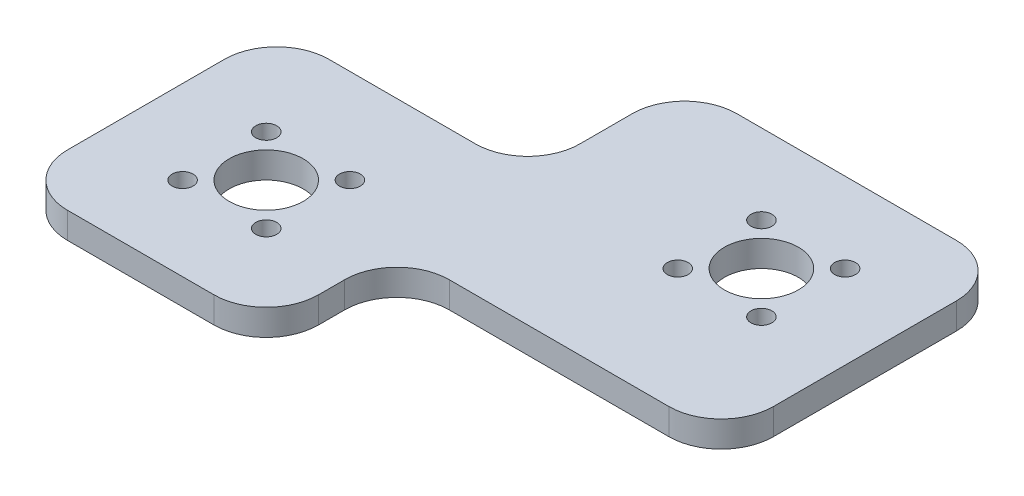
ISO-10303-21;
HEADER;
FILE_DESCRIPTION(('STEP AP214'),'2;1');
FILE_NAME('part.step','',(''),(''),'','','');
FILE_SCHEMA(('AUTOMOTIVE_DESIGN { 1 0 10303 214 1 1 1 1 }'));
ENDSEC;
DATA;
#1=APPLICATION_CONTEXT('core data for automotive mechanical design processes');
#2=APPLICATION_PROTOCOL_DEFINITION('international standard','automotive_design',2000,#1);
#3=PRODUCT_CONTEXT('',#1,'mechanical');
#4=PRODUCT('Part','Part','',(#3));
#5=PRODUCT_RELATED_PRODUCT_CATEGORY('part','',(#4));
#6=PRODUCT_DEFINITION_FORMATION('','',#4);
#7=PRODUCT_DEFINITION_CONTEXT('part definition',#1,'design');
#8=PRODUCT_DEFINITION('design','',#6,#7);
#9=PRODUCT_DEFINITION_SHAPE('','',#8);
#10=(LENGTH_UNIT() NAMED_UNIT(*) SI_UNIT(.MILLI.,.METRE.));
#11=(NAMED_UNIT(*) PLANE_ANGLE_UNIT() SI_UNIT($,.RADIAN.));
#12=(NAMED_UNIT(*) SI_UNIT($,.STERADIAN.) SOLID_ANGLE_UNIT());
#13=UNCERTAINTY_MEASURE_WITH_UNIT(LENGTH_MEASURE(1.E-05),#10,'distance_accuracy_value','');
#14=(GEOMETRIC_REPRESENTATION_CONTEXT(3) GLOBAL_UNCERTAINTY_ASSIGNED_CONTEXT((#13)) GLOBAL_UNIT_ASSIGNED_CONTEXT((#10,
#11,#12)) REPRESENTATION_CONTEXT('',''));
#15=CARTESIAN_POINT('',(0.,0.,0.));
#16=DIRECTION('',(0.,0.,1.));
#17=DIRECTION('',(1.,0.,0.));
#18=AXIS2_PLACEMENT_3D('',#15,#16,#17);
#19=CARTESIAN_POINT('',(0.,5.,-46.9463087248322));
#20=DIRECTION('',(0.,0.,-1.));
#21=DIRECTION('',(-1.,0.,0.));
#22=AXIS2_PLACEMENT_3D('',#19,#20,#21);
#23=PLANE('',#22);
#24=DIRECTION('',(1.,0.,0.));
#25=VECTOR('',#24,1.);
#26=CARTESIAN_POINT('',(0.,5.,-46.9463087248322));
#27=LINE('',#26,#25);
#28=CARTESIAN_POINT('',(-30.9261744966443,5.,-46.9463087248322));
#29=VERTEX_POINT('',#28);
#30=CARTESIAN_POINT('',(11.0738255033557,5.,-46.9463087248322));
#31=VERTEX_POINT('',#30);
#32=EDGE_CURVE('E242',#29,#31,#27,.T.);
#33=ORIENTED_EDGE('',*,*,#32,.T.);
#34=DIRECTION('',(0.,-1.,0.));
#35=VECTOR('',#34,1.);
#36=CARTESIAN_POINT('',(11.0738255033557,0.,-46.9463087248322));
#37=LINE('',#36,#35);
#38=CARTESIAN_POINT('',(11.0738255033557,0.,-46.9463087248322));
#39=VERTEX_POINT('',#38);
#40=EDGE_CURVE('E289',#31,#39,#37,.T.);
#41=ORIENTED_EDGE('',*,*,#40,.T.);
#42=DIRECTION('',(1.,0.,0.));
#43=VECTOR('',#42,1.);
#44=CARTESIAN_POINT('',(0.,0.,-46.9463087248322));
#45=LINE('',#44,#43);
#46=CARTESIAN_POINT('',(-30.9261744966443,0.,-46.9463087248322));
#47=VERTEX_POINT('',#46);
#48=EDGE_CURVE('E307',#47,#39,#45,.T.);
#49=ORIENTED_EDGE('',*,*,#48,.F.);
#50=DIRECTION('',(0.,-1.,0.));
#51=VECTOR('',#50,1.);
#52=CARTESIAN_POINT('',(-30.9261744966443,5.,-46.9463087248322));
#53=LINE('',#52,#51);
#54=EDGE_CURVE('E287',#47,#29,#53,.F.);
#55=ORIENTED_EDGE('',*,*,#54,.T.);
#56=EDGE_LOOP('',(#33,#41,#49,#55));
#57=FACE_BOUND('',#56,.T.);
#58=ADVANCED_FACE('F88',(#57),#23,.T.);
#59=CARTESIAN_POINT('',(-40.9261744966443,5.,0.));
#60=DIRECTION('',(-1.,0.,0.));
#61=DIRECTION('',(0.,0.,1.));
#62=AXIS2_PLACEMENT_3D('',#59,#60,#61);
#63=PLANE('',#62);
#64=DIRECTION('',(0.,0.,-1.));
#65=VECTOR('',#64,1.);
#66=CARTESIAN_POINT('',(-40.9261744966443,5.,0.));
#67=LINE('',#66,#65);
#68=CARTESIAN_POINT('',(-40.9261744966443,5.,-26.9463087248322));
#69=VERTEX_POINT('',#68);
#70=CARTESIAN_POINT('',(-40.9261744966443,5.,-36.9463087248322));
#71=VERTEX_POINT('',#70);
#72=EDGE_CURVE('E313',#69,#71,#67,.T.);
#73=ORIENTED_EDGE('',*,*,#72,.T.);
#74=DIRECTION('',(0.,-1.,0.));
#75=VECTOR('',#74,1.);
#76=CARTESIAN_POINT('',(-40.9261744966443,5.,-36.9463087248322));
#77=LINE('',#76,#75);
#78=CARTESIAN_POINT('',(-40.9261744966443,0.,-36.9463087248322));
#79=VERTEX_POINT('',#78);
#80=EDGE_CURVE('E293',#71,#79,#77,.T.);
#81=ORIENTED_EDGE('',*,*,#80,.T.);
#82=DIRECTION('',(0.,0.,-1.));
#83=VECTOR('',#82,1.);
#84=CARTESIAN_POINT('',(-40.9261744966443,0.,0.));
#85=LINE('',#84,#83);
#86=CARTESIAN_POINT('',(-40.9261744966443,0.,-26.9463087248322));
#87=VERTEX_POINT('',#86);
#88=EDGE_CURVE('E231',#87,#79,#85,.T.);
#89=ORIENTED_EDGE('',*,*,#88,.F.);
#90=DIRECTION('',(0.,-1.,0.));
#91=VECTOR('',#90,1.);
#92=CARTESIAN_POINT('',(-40.9261744966443,5.,-26.9463087248322));
#93=LINE('',#92,#91);
#94=EDGE_CURVE('E110',#87,#69,#93,.F.);
#95=ORIENTED_EDGE('',*,*,#94,.T.);
#96=EDGE_LOOP('',(#73,#81,#89,#95));
#97=FACE_BOUND('',#96,.T.);
#98=ADVANCED_FACE('F305',(#97),#63,.T.);
#99=CARTESIAN_POINT('',(0.,5.,-16.9463087248322));
#100=DIRECTION('',(0.,0.,-1.));
#101=DIRECTION('',(-1.,0.,0.));
#102=AXIS2_PLACEMENT_3D('',#99,#100,#101);
#103=PLANE('',#102);
#104=DIRECTION('',(1.,0.,0.));
#105=VECTOR('',#104,1.);
#106=CARTESIAN_POINT('',(0.,5.,-16.9463087248322));
#107=LINE('',#106,#105);
#108=CARTESIAN_POINT('',(-78.9261744966443,5.,-16.9463087248322));
#109=VERTEX_POINT('',#108);
#110=CARTESIAN_POINT('',(-50.9261744966443,5.,-16.9463087248322));
#111=VERTEX_POINT('',#110);
#112=EDGE_CURVE('E312',#109,#111,#107,.T.);
#113=ORIENTED_EDGE('',*,*,#112,.T.);
#114=DIRECTION('',(0.,-1.,0.));
#115=VECTOR('',#114,1.);
#116=CARTESIAN_POINT('',(-50.9261744966443,0.,-16.9463087248322));
#117=LINE('',#116,#115);
#118=CARTESIAN_POINT('',(-50.9261744966443,0.,-16.9463087248322));
#119=VERTEX_POINT('',#118);
#120=EDGE_CURVE('E296',#111,#119,#117,.T.);
#121=ORIENTED_EDGE('',*,*,#120,.T.);
#122=DIRECTION('',(1.,0.,0.));
#123=VECTOR('',#122,1.);
#124=CARTESIAN_POINT('',(0.,0.,-16.9463087248322));
#125=LINE('',#124,#123);
#126=CARTESIAN_POINT('',(-78.9261744966443,0.,-16.9463087248322));
#127=VERTEX_POINT('',#126);
#128=EDGE_CURVE('E227',#127,#119,#125,.T.);
#129=ORIENTED_EDGE('',*,*,#128,.F.);
#130=DIRECTION('',(0.,-1.,0.));
#131=VECTOR('',#130,1.);
#132=CARTESIAN_POINT('',(-78.9261744966443,5.,-16.9463087248322));
#133=LINE('',#132,#131);
#134=EDGE_CURVE('E207',#127,#109,#133,.F.);
#135=ORIENTED_EDGE('',*,*,#134,.T.);
#136=EDGE_LOOP('',(#113,#121,#129,#135));
#137=FACE_BOUND('',#136,.T.);
#138=ADVANCED_FACE('F315',(#137),#103,.T.);
#139=CARTESIAN_POINT('',(-88.9261744966443,5.,0.));
#140=DIRECTION('',(1.,0.,0.));
#141=DIRECTION('',(0.,0.,-1.));
#142=AXIS2_PLACEMENT_3D('',#139,#140,#141);
#143=PLANE('',#142);
#144=DIRECTION('',(0.,0.,1.));
#145=VECTOR('',#144,1.);
#146=CARTESIAN_POINT('',(-88.9261744966443,0.,0.));
#147=LINE('',#146,#145);
#148=CARTESIAN_POINT('',(-88.9261744966443,0.,-6.94630872483223));
#149=VERTEX_POINT('',#148);
#150=CARTESIAN_POINT('',(-88.9261744966443,0.,23.0536912751678));
#151=VERTEX_POINT('',#150);
#152=EDGE_CURVE('E217',#149,#151,#147,.T.);
#153=ORIENTED_EDGE('',*,*,#152,.T.);
#154=DIRECTION('',(0.,-1.,0.));
#155=VECTOR('',#154,1.);
#156=CARTESIAN_POINT('',(-88.9261744966443,5.,23.0536912751678));
#157=LINE('',#156,#155);
#158=CARTESIAN_POINT('',(-88.9261744966443,5.,23.0536912751678));
#159=VERTEX_POINT('',#158);
#160=EDGE_CURVE('E261',#151,#159,#157,.F.);
#161=ORIENTED_EDGE('',*,*,#160,.T.);
#162=DIRECTION('',(0.,0.,1.));
#163=VECTOR('',#162,1.);
#164=CARTESIAN_POINT('',(-88.9261744966443,5.,0.));
#165=LINE('',#164,#163);
#166=CARTESIAN_POINT('',(-88.9261744966443,5.,-6.94630872483223));
#167=VERTEX_POINT('',#166);
#168=EDGE_CURVE('E220',#167,#159,#165,.T.);
#169=ORIENTED_EDGE('',*,*,#168,.F.);
#170=DIRECTION('',(0.,-1.,0.));
#171=VECTOR('',#170,1.);
#172=CARTESIAN_POINT('',(-88.9261744966443,0.,-6.94630872483223));
#173=LINE('',#172,#171);
#174=EDGE_CURVE('E206',#167,#149,#173,.T.);
#175=ORIENTED_EDGE('',*,*,#174,.T.);
#176=EDGE_LOOP('',(#153,#161,#169,#175));
#177=FACE_BOUND('',#176,.T.);
#178=ADVANCED_FACE('F216',(#177),#143,.F.);
#179=CARTESIAN_POINT('',(0.,5.,33.0536912751678));
#180=DIRECTION('',(0.,0.,1.));
#181=DIRECTION('',(1.,0.,0.));
#182=AXIS2_PLACEMENT_3D('',#179,#180,#181);
#183=PLANE('',#182);
#184=DIRECTION('',(-1.,0.,0.));
#185=VECTOR('',#184,1.);
#186=CARTESIAN_POINT('',(0.,5.,33.0536912751678));
#187=LINE('',#186,#185);
#188=CARTESIAN_POINT('',(-50.9261744966443,5.,33.0536912751678));
#189=VERTEX_POINT('',#188);
#190=CARTESIAN_POINT('',(-78.9261744966443,5.,33.0536912751678));
#191=VERTEX_POINT('',#190);
#192=EDGE_CURVE('E317',#189,#191,#187,.T.);
#193=ORIENTED_EDGE('',*,*,#192,.T.);
#194=DIRECTION('',(0.,-1.,0.));
#195=VECTOR('',#194,1.);
#196=CARTESIAN_POINT('',(-78.9261744966443,0.,33.0536912751678));
#197=LINE('',#196,#195);
#198=CARTESIAN_POINT('',(-78.9261744966443,0.,33.0536912751678));
#199=VERTEX_POINT('',#198);
#200=EDGE_CURVE('E249',#191,#199,#197,.T.);
#201=ORIENTED_EDGE('',*,*,#200,.T.);
#202=DIRECTION('',(-1.,0.,0.));
#203=VECTOR('',#202,1.);
#204=CARTESIAN_POINT('',(0.,0.,33.0536912751678));
#205=LINE('',#204,#203);
#206=CARTESIAN_POINT('',(-50.9261744966443,0.,33.0536912751678));
#207=VERTEX_POINT('',#206);
#208=EDGE_CURVE('E226',#207,#199,#205,.T.);
#209=ORIENTED_EDGE('',*,*,#208,.F.);
#210=DIRECTION('',(0.,-1.,0.));
#211=VECTOR('',#210,1.);
#212=CARTESIAN_POINT('',(-50.9261744966443,5.,33.0536912751678));
#213=LINE('',#212,#211);
#214=EDGE_CURVE('E247',#207,#189,#213,.F.);
#215=ORIENTED_EDGE('',*,*,#214,.T.);
#216=EDGE_LOOP('',(#193,#201,#209,#215));
#217=FACE_BOUND('',#216,.T.);
#218=ADVANCED_FACE('F383',(#217),#183,.T.);
#219=CARTESIAN_POINT('',(-40.9261744966443,5.,0.));
#220=DIRECTION('',(-1.,0.,0.));
#221=DIRECTION('',(0.,0.,1.));
#222=AXIS2_PLACEMENT_3D('',#219,#220,#221);
#223=PLANE('',#222);
#224=DIRECTION('',(0.,0.,-1.));
#225=VECTOR('',#224,1.);
#226=CARTESIAN_POINT('',(-40.9261744966443,5.,0.));
#227=LINE('',#226,#225);
#228=CARTESIAN_POINT('',(-40.9261744966443,5.,23.0536912751678));
#229=VERTEX_POINT('',#228);
#230=CARTESIAN_POINT('',(-40.9261744966443,5.,18.0536912751678));
#231=VERTEX_POINT('',#230);
#232=EDGE_CURVE('E324',#229,#231,#227,.T.);
#233=ORIENTED_EDGE('',*,*,#232,.F.);
#234=DIRECTION('',(0.,-1.,0.));
#235=VECTOR('',#234,1.);
#236=CARTESIAN_POINT('',(-40.9261744966443,0.,23.0536912751678));
#237=LINE('',#236,#235);
#238=CARTESIAN_POINT('',(-40.9261744966443,0.,23.0536912751678));
#239=VERTEX_POINT('',#238);
#240=EDGE_CURVE('E274',#229,#239,#237,.T.);
#241=ORIENTED_EDGE('',*,*,#240,.T.);
#242=DIRECTION('',(0.,0.,-1.));
#243=VECTOR('',#242,1.);
#244=CARTESIAN_POINT('',(-40.9261744966443,0.,0.));
#245=LINE('',#244,#243);
#246=CARTESIAN_POINT('',(-40.9261744966443,0.,18.0536912751678));
#247=VERTEX_POINT('',#246);
#248=EDGE_CURVE('E229',#239,#247,#245,.T.);
#249=ORIENTED_EDGE('',*,*,#248,.T.);
#250=DIRECTION('',(0.,-1.,0.));
#251=VECTOR('',#250,1.);
#252=CARTESIAN_POINT('',(-40.9261744966443,5.,18.0536912751678));
#253=LINE('',#252,#251);
#254=EDGE_CURVE('E272',#247,#231,#253,.F.);
#255=ORIENTED_EDGE('',*,*,#254,.T.);
#256=EDGE_LOOP('',(#233,#241,#249,#255));
#257=FACE_BOUND('',#256,.T.);
#258=ADVANCED_FACE('F375',(#257),#223,.F.);
#259=CARTESIAN_POINT('',(0.,5.,8.05369127516778));
#260=DIRECTION('',(0.,0.,1.));
#261=DIRECTION('',(1.,0.,0.));
#262=AXIS2_PLACEMENT_3D('',#259,#260,#261);
#263=PLANE('',#262);
#264=DIRECTION('',(-1.,0.,0.));
#265=VECTOR('',#264,1.);
#266=CARTESIAN_POINT('',(0.,5.,8.05369127516778));
#267=LINE('',#266,#265);
#268=CARTESIAN_POINT('',(11.0738255033557,5.,8.05369127516779));
#269=VERTEX_POINT('',#268);
#270=CARTESIAN_POINT('',(-30.9261744966443,5.,8.05369127516777));
#271=VERTEX_POINT('',#270);
#272=EDGE_CURVE('E327',#269,#271,#267,.T.);
#273=ORIENTED_EDGE('',*,*,#272,.T.);
#274=DIRECTION('',(0.,-1.,0.));
#275=VECTOR('',#274,1.);
#276=CARTESIAN_POINT('',(-30.9261744966443,5.,8.05369127516777));
#277=LINE('',#276,#275);
#278=CARTESIAN_POINT('',(-30.9261744966443,0.,8.05369127516777));
#279=VERTEX_POINT('',#278);
#280=EDGE_CURVE('E279',#271,#279,#277,.T.);
#281=ORIENTED_EDGE('',*,*,#280,.T.);
#282=DIRECTION('',(-1.,0.,0.));
#283=VECTOR('',#282,1.);
#284=CARTESIAN_POINT('',(0.,0.,8.05369127516778));
#285=LINE('',#284,#283);
#286=CARTESIAN_POINT('',(11.0738255033557,0.,8.05369127516779));
#287=VERTEX_POINT('',#286);
#288=EDGE_CURVE('E237',#287,#279,#285,.T.);
#289=ORIENTED_EDGE('',*,*,#288,.F.);
#290=DIRECTION('',(0.,-1.,0.));
#291=VECTOR('',#290,1.);
#292=CARTESIAN_POINT('',(11.0738255033557,5.,8.05369127516779));
#293=LINE('',#292,#291);
#294=EDGE_CURVE('E277',#287,#269,#293,.F.);
#295=ORIENTED_EDGE('',*,*,#294,.T.);
#296=EDGE_LOOP('',(#273,#281,#289,#295));
#297=FACE_BOUND('',#296,.T.);
#298=ADVANCED_FACE('F365',(#297),#263,.T.);
#299=CARTESIAN_POINT('',(21.0738255033557,5.,0.));
#300=DIRECTION('',(-1.,0.,0.));
#301=DIRECTION('',(0.,0.,1.));
#302=AXIS2_PLACEMENT_3D('',#299,#300,#301);
#303=PLANE('',#302);
#304=DIRECTION('',(0.,0.,-1.));
#305=VECTOR('',#304,1.);
#306=CARTESIAN_POINT('',(21.0738255033557,5.,0.));
#307=LINE('',#306,#305);
#308=CARTESIAN_POINT('',(21.0738255033557,5.,-1.94630872483221));
#309=VERTEX_POINT('',#308);
#310=CARTESIAN_POINT('',(21.0738255033557,5.,-36.9463087248322));
#311=VERTEX_POINT('',#310);
#312=EDGE_CURVE('E221',#309,#311,#307,.T.);
#313=ORIENTED_EDGE('',*,*,#312,.F.);
#314=DIRECTION('',(0.,-1.,0.));
#315=VECTOR('',#314,1.);
#316=CARTESIAN_POINT('',(21.0738255033557,0.,-1.94630872483221));
#317=LINE('',#316,#315);
#318=CARTESIAN_POINT('',(21.0738255033557,0.,-1.94630872483221));
#319=VERTEX_POINT('',#318);
#320=EDGE_CURVE('E284',#309,#319,#317,.T.);
#321=ORIENTED_EDGE('',*,*,#320,.T.);
#322=DIRECTION('',(0.,0.,-1.));
#323=VECTOR('',#322,1.);
#324=CARTESIAN_POINT('',(21.0738255033557,0.,0.));
#325=LINE('',#324,#323);
#326=CARTESIAN_POINT('',(21.0738255033557,0.,-36.9463087248322));
#327=VERTEX_POINT('',#326);
#328=EDGE_CURVE('E240',#319,#327,#325,.T.);
#329=ORIENTED_EDGE('',*,*,#328,.T.);
#330=DIRECTION('',(0.,-1.,0.));
#331=VECTOR('',#330,1.);
#332=CARTESIAN_POINT('',(21.0738255033557,5.,-36.9463087248322));
#333=LINE('',#332,#331);
#334=EDGE_CURVE('E282',#327,#311,#333,.F.);
#335=ORIENTED_EDGE('',*,*,#334,.T.);
#336=EDGE_LOOP('',(#313,#321,#329,#335));
#337=FACE_BOUND('',#336,.T.);
#338=ADVANCED_FACE('F357',(#337),#303,.F.);
#339=CARTESIAN_POINT('',(0.,5.,0.));
#340=DIRECTION('',(0.,1.,0.));
#341=DIRECTION('',(0.,0.,1.));
#342=AXIS2_PLACEMENT_3D('',#339,#340,#341);
#343=PLANE('',#342);
#344=CARTESIAN_POINT('',(-72.9261744966443,5.,1.05369127516777));
#345=DIRECTION('',(0.,1.,0.));
#346=DIRECTION('',(0.,0.,1.));
#347=AXIS2_PLACEMENT_3D('',#344,#345,#346);
#348=CIRCLE('',#347,2.);
#349=CARTESIAN_POINT('',(-72.9261744966443,5.,3.05369127516777));
#350=VERTEX_POINT('',#349);
#351=EDGE_CURVE('E341',#350,#350,#348,.T.);
#352=ORIENTED_EDGE('',*,*,#351,.F.);
#353=EDGE_LOOP('',(#352));
#354=FACE_BOUND('',#353,.T.);
#355=CARTESIAN_POINT('',(-56.9261744966443,5.,1.05369127516777));
#356=DIRECTION('',(0.,1.,0.));
#357=DIRECTION('',(0.,0.,1.));
#358=AXIS2_PLACEMENT_3D('',#355,#356,#357);
#359=CIRCLE('',#358,2.);
#360=CARTESIAN_POINT('',(-56.9261744966443,5.,3.05369127516777));
#361=VERTEX_POINT('',#360);
#362=EDGE_CURVE('E483',#361,#361,#359,.T.);
#363=ORIENTED_EDGE('',*,*,#362,.F.);
#364=EDGE_LOOP('',(#363));
#365=FACE_BOUND('',#364,.T.);
#366=CARTESIAN_POINT('',(-56.9261744966441,5.,17.0536912751678));
#367=DIRECTION('',(0.,1.,0.));
#368=DIRECTION('',(0.,0.,1.));
#369=AXIS2_PLACEMENT_3D('',#366,#367,#368);
#370=CIRCLE('',#369,2.);
#371=CARTESIAN_POINT('',(-56.9261744966441,5.,19.0536912751678));
#372=VERTEX_POINT('',#371);
#373=EDGE_CURVE('E489',#372,#372,#370,.T.);
#374=ORIENTED_EDGE('',*,*,#373,.F.);
#375=EDGE_LOOP('',(#374));
#376=FACE_BOUND('',#375,.T.);
#377=CARTESIAN_POINT('',(-72.9261744966441,5.,17.0536912751678));
#378=DIRECTION('',(0.,1.,0.));
#379=DIRECTION('',(0.,0.,1.));
#380=AXIS2_PLACEMENT_3D('',#377,#378,#379);
#381=CIRCLE('',#380,2.);
#382=CARTESIAN_POINT('',(-72.9261744966441,5.,19.0536912751678));
#383=VERTEX_POINT('',#382);
#384=EDGE_CURVE('E495',#383,#383,#381,.T.);
#385=ORIENTED_EDGE('',*,*,#384,.F.);
#386=EDGE_LOOP('',(#385));
#387=FACE_BOUND('',#386,.T.);
#388=CARTESIAN_POINT('',(-10.9261744966443,5.,-31.643183553195));
#389=DIRECTION('',(0.,1.,0.));
#390=DIRECTION('',(0.,0.,1.));
#391=AXIS2_PLACEMENT_3D('',#388,#389,#390);
#392=CIRCLE('',#391,2.);
#393=CARTESIAN_POINT('',(-10.9261744966443,5.,-29.643183553195));
#394=VERTEX_POINT('',#393);
#395=EDGE_CURVE('E474',#394,#394,#392,.T.);
#396=ORIENTED_EDGE('',*,*,#395,.F.);
#397=EDGE_LOOP('',(#396));
#398=FACE_BOUND('',#397,.T.);
#399=CARTESIAN_POINT('',(-10.9261744966441,5.,-15.643183553195));
#400=DIRECTION('',(0.,1.,0.));
#401=DIRECTION('',(0.,0.,1.));
#402=AXIS2_PLACEMENT_3D('',#399,#400,#401);
#403=CIRCLE('',#402,2.);
#404=CARTESIAN_POINT('',(-10.9261744966441,5.,-13.643183553195));
#405=VERTEX_POINT('',#404);
#406=EDGE_CURVE('E502',#405,#405,#403,.T.);
#407=ORIENTED_EDGE('',*,*,#406,.F.);
#408=EDGE_LOOP('',(#407));
#409=FACE_BOUND('',#408,.T.);
#410=CARTESIAN_POINT('',(-2.92617449664428,5.,-23.643183553195));
#411=DIRECTION('',(0.,1.,0.));
#412=DIRECTION('',(0.,0.,1.));
#413=AXIS2_PLACEMENT_3D('',#410,#411,#412);
#414=CIRCLE('',#413,7.075);
#415=CARTESIAN_POINT('',(-2.92617449664428,5.,-16.568183553195));
#416=VERTEX_POINT('',#415);
#417=EDGE_CURVE('E501',#416,#416,#414,.T.);
#418=ORIENTED_EDGE('',*,*,#417,.F.);
#419=EDGE_LOOP('',(#418));
#420=FACE_BOUND('',#419,.T.);
#421=CARTESIAN_POINT('',(5.07382550335572,5.,-31.643183553195));
#422=DIRECTION('',(0.,1.,0.));
#423=DIRECTION('',(0.,0.,1.));
#424=AXIS2_PLACEMENT_3D('',#421,#422,#423);
#425=CIRCLE('',#424,2.);
#426=CARTESIAN_POINT('',(5.07382550335572,5.,-29.643183553195));
#427=VERTEX_POINT('',#426);
#428=EDGE_CURVE('E511',#427,#427,#425,.T.);
#429=ORIENTED_EDGE('',*,*,#428,.F.);
#430=EDGE_LOOP('',(#429));
#431=FACE_BOUND('',#430,.T.);
#432=CARTESIAN_POINT('',(5.07382550335589,5.,-15.643183553195));
#433=DIRECTION('',(0.,1.,0.));
#434=DIRECTION('',(0.,0.,1.));
#435=AXIS2_PLACEMENT_3D('',#432,#433,#434);
#436=CIRCLE('',#435,2.);
#437=CARTESIAN_POINT('',(5.07382550335589,5.,-13.643183553195));
#438=VERTEX_POINT('',#437);
#439=EDGE_CURVE('E469',#438,#438,#436,.T.);
#440=ORIENTED_EDGE('',*,*,#439,.F.);
#441=EDGE_LOOP('',(#440));
#442=FACE_BOUND('',#441,.T.);
#443=CARTESIAN_POINT('',(-64.9261744966443,5.,9.05369127516778));
#444=DIRECTION('',(0.,1.,0.));
#445=DIRECTION('',(0.,0.,1.));
#446=AXIS2_PLACEMENT_3D('',#443,#444,#445);
#447=CIRCLE('',#446,7.075);
#448=CARTESIAN_POINT('',(-64.9261744966443,5.,16.1286912751678));
#449=VERTEX_POINT('',#448);
#450=EDGE_CURVE('E336',#449,#449,#447,.T.);
#451=ORIENTED_EDGE('',*,*,#450,.F.);
#452=EDGE_LOOP('',(#451));
#453=FACE_BOUND('',#452,.T.);
#454=ORIENTED_EDGE('',*,*,#168,.T.);
#455=CARTESIAN_POINT('',(-78.9261744966443,5.,23.0536912751678));
#456=DIRECTION('',(0.,1.,0.));
#457=DIRECTION('',(0.,0.,1.));
#458=AXIS2_PLACEMENT_3D('',#455,#456,#457);
#459=CIRCLE('',#458,10.);
#460=EDGE_CURVE('E270',#159,#191,#459,.T.);
#461=ORIENTED_EDGE('',*,*,#460,.T.);
#462=ORIENTED_EDGE('',*,*,#192,.F.);
#463=CARTESIAN_POINT('',(-50.9261744966443,5.,23.0536912751678));
#464=DIRECTION('',(0.,1.,0.));
#465=DIRECTION('',(0.,0.,1.));
#466=AXIS2_PLACEMENT_3D('',#463,#464,#465);
#467=CIRCLE('',#466,10.);
#468=EDGE_CURVE('E268',#189,#229,#467,.T.);
#469=ORIENTED_EDGE('',*,*,#468,.T.);
#470=ORIENTED_EDGE('',*,*,#232,.T.);
#471=CARTESIAN_POINT('',(-30.9261744966443,5.,18.0536912751678));
#472=DIRECTION('',(0.,1.,0.));
#473=DIRECTION('',(0.,0.,1.));
#474=AXIS2_PLACEMENT_3D('',#471,#472,#473);
#475=CIRCLE('',#474,10.);
#476=EDGE_CURVE('E301',#231,#271,#475,.F.);
#477=ORIENTED_EDGE('',*,*,#476,.T.);
#478=ORIENTED_EDGE('',*,*,#272,.F.);
#479=CARTESIAN_POINT('',(11.0738255033557,5.,-1.94630872483221));
#480=DIRECTION('',(0.,1.,0.));
#481=DIRECTION('',(0.,0.,1.));
#482=AXIS2_PLACEMENT_3D('',#479,#480,#481);
#483=CIRCLE('',#482,10.);
#484=EDGE_CURVE('E266',#269,#309,#483,.T.);
#485=ORIENTED_EDGE('',*,*,#484,.T.);
#486=ORIENTED_EDGE('',*,*,#312,.T.);
#487=CARTESIAN_POINT('',(11.0738255033557,5.,-36.9463087248322));
#488=DIRECTION('',(0.,1.,0.));
#489=DIRECTION('',(0.,0.,1.));
#490=AXIS2_PLACEMENT_3D('',#487,#488,#489);
#491=CIRCLE('',#490,10.);
#492=EDGE_CURVE('E264',#311,#31,#491,.T.);
#493=ORIENTED_EDGE('',*,*,#492,.T.);
#494=ORIENTED_EDGE('',*,*,#32,.F.);
#495=CARTESIAN_POINT('',(-30.9261744966443,5.,-36.9463087248322));
#496=DIRECTION('',(0.,1.,0.));
#497=DIRECTION('',(0.,0.,1.));
#498=AXIS2_PLACEMENT_3D('',#495,#496,#497);
#499=CIRCLE('',#498,10.);
#500=EDGE_CURVE('E103',#29,#71,#499,.T.);
#501=ORIENTED_EDGE('',*,*,#500,.T.);
#502=ORIENTED_EDGE('',*,*,#72,.F.);
#503=CARTESIAN_POINT('',(-50.9261744966443,5.,-26.9463087248322));
#504=DIRECTION('',(0.,1.,0.));
#505=DIRECTION('',(0.,0.,1.));
#506=AXIS2_PLACEMENT_3D('',#503,#504,#505);
#507=CIRCLE('',#506,10.);
#508=EDGE_CURVE('E12',#69,#111,#507,.F.);
#509=ORIENTED_EDGE('',*,*,#508,.T.);
#510=ORIENTED_EDGE('',*,*,#112,.F.);
#511=CARTESIAN_POINT('',(-78.9261744966443,5.,-6.94630872483223));
#512=DIRECTION('',(0.,1.,0.));
#513=DIRECTION('',(0.,0.,1.));
#514=AXIS2_PLACEMENT_3D('',#511,#512,#513);
#515=CIRCLE('',#514,10.);
#516=EDGE_CURVE('E245',#109,#167,#515,.T.);
#517=ORIENTED_EDGE('',*,*,#516,.T.);
#518=EDGE_LOOP('',(#454,#461,#462,#469,#470,#477,#478,#485,#486,#493,#494,#501,#502,#509,#510,#517));
#519=FACE_BOUND('',#518,.T.);
#520=ADVANCED_FACE('F311',(#354,#365,#376,#387,#398,#409,#420,#431,#442,#453,#519),#343,.T.);
#521=CARTESIAN_POINT('',(0.,0.,0.));
#522=DIRECTION('',(0.,1.,0.));
#523=DIRECTION('',(0.,0.,1.));
#524=AXIS2_PLACEMENT_3D('',#521,#522,#523);
#525=PLANE('',#524);
#526=CARTESIAN_POINT('',(-72.9261744966443,0.,1.05369127516777));
#527=DIRECTION('',(0.,1.,0.));
#528=DIRECTION('',(0.,0.,1.));
#529=AXIS2_PLACEMENT_3D('',#526,#527,#528);
#530=CIRCLE('',#529,2.);
#531=CARTESIAN_POINT('',(-72.9261744966443,0.,3.05369127516777));
#532=VERTEX_POINT('',#531);
#533=EDGE_CURVE('E480',#532,#532,#530,.T.);
#534=ORIENTED_EDGE('',*,*,#533,.T.);
#535=EDGE_LOOP('',(#534));
#536=FACE_BOUND('',#535,.T.);
#537=CARTESIAN_POINT('',(-56.9261744966443,0.,1.05369127516777));
#538=DIRECTION('',(0.,1.,0.));
#539=DIRECTION('',(0.,0.,1.));
#540=AXIS2_PLACEMENT_3D('',#537,#538,#539);
#541=CIRCLE('',#540,2.);
#542=CARTESIAN_POINT('',(-56.9261744966443,0.,3.05369127516777));
#543=VERTEX_POINT('',#542);
#544=EDGE_CURVE('E486',#543,#543,#541,.T.);
#545=ORIENTED_EDGE('',*,*,#544,.T.);
#546=EDGE_LOOP('',(#545));
#547=FACE_BOUND('',#546,.T.);
#548=CARTESIAN_POINT('',(-56.9261744966441,0.,17.0536912751678));
#549=DIRECTION('',(0.,1.,0.));
#550=DIRECTION('',(0.,0.,1.));
#551=AXIS2_PLACEMENT_3D('',#548,#549,#550);
#552=CIRCLE('',#551,2.);
#553=CARTESIAN_POINT('',(-56.9261744966441,0.,19.0536912751678));
#554=VERTEX_POINT('',#553);
#555=EDGE_CURVE('E492',#554,#554,#552,.T.);
#556=ORIENTED_EDGE('',*,*,#555,.T.);
#557=EDGE_LOOP('',(#556));
#558=FACE_BOUND('',#557,.T.);
#559=CARTESIAN_POINT('',(-72.9261744966441,0.,17.0536912751678));
#560=DIRECTION('',(0.,1.,0.));
#561=DIRECTION('',(0.,0.,1.));
#562=AXIS2_PLACEMENT_3D('',#559,#560,#561);
#563=CIRCLE('',#562,2.);
#564=CARTESIAN_POINT('',(-72.9261744966441,0.,19.0536912751678));
#565=VERTEX_POINT('',#564);
#566=EDGE_CURVE('E498',#565,#565,#563,.T.);
#567=ORIENTED_EDGE('',*,*,#566,.T.);
#568=EDGE_LOOP('',(#567));
#569=FACE_BOUND('',#568,.T.);
#570=CARTESIAN_POINT('',(-10.9261744966443,0.,-31.643183553195));
#571=DIRECTION('',(0.,1.,0.));
#572=DIRECTION('',(0.,0.,1.));
#573=AXIS2_PLACEMENT_3D('',#570,#571,#572);
#574=CIRCLE('',#573,2.);
#575=CARTESIAN_POINT('',(-10.9261744966443,0.,-29.643183553195));
#576=VERTEX_POINT('',#575);
#577=EDGE_CURVE('E471',#576,#576,#574,.T.);
#578=ORIENTED_EDGE('',*,*,#577,.T.);
#579=EDGE_LOOP('',(#578));
#580=FACE_BOUND('',#579,.T.);
#581=CARTESIAN_POINT('',(-10.9261744966441,0.,-15.643183553195));
#582=DIRECTION('',(0.,1.,0.));
#583=DIRECTION('',(0.,0.,1.));
#584=AXIS2_PLACEMENT_3D('',#581,#582,#583);
#585=CIRCLE('',#584,2.);
#586=CARTESIAN_POINT('',(-10.9261744966441,0.,-13.643183553195));
#587=VERTEX_POINT('',#586);
#588=EDGE_CURVE('E506',#587,#587,#585,.T.);
#589=ORIENTED_EDGE('',*,*,#588,.T.);
#590=EDGE_LOOP('',(#589));
#591=FACE_BOUND('',#590,.T.);
#592=CARTESIAN_POINT('',(-2.92617449664428,0.,-23.643183553195));
#593=DIRECTION('',(0.,1.,0.));
#594=DIRECTION('',(0.,0.,1.));
#595=AXIS2_PLACEMENT_3D('',#592,#593,#594);
#596=CIRCLE('',#595,7.075);
#597=CARTESIAN_POINT('',(-2.92617449664428,0.,-16.568183553195));
#598=VERTEX_POINT('',#597);
#599=EDGE_CURVE('E344',#598,#598,#596,.T.);
#600=ORIENTED_EDGE('',*,*,#599,.T.);
#601=EDGE_LOOP('',(#600));
#602=FACE_BOUND('',#601,.T.);
#603=CARTESIAN_POINT('',(5.07382550335572,0.,-31.643183553195));
#604=DIRECTION('',(0.,1.,0.));
#605=DIRECTION('',(0.,0.,1.));
#606=AXIS2_PLACEMENT_3D('',#603,#604,#605);
#607=CIRCLE('',#606,2.);
#608=CARTESIAN_POINT('',(5.07382550335572,0.,-29.643183553195));
#609=VERTEX_POINT('',#608);
#610=EDGE_CURVE('E505',#609,#609,#607,.T.);
#611=ORIENTED_EDGE('',*,*,#610,.T.);
#612=EDGE_LOOP('',(#611));
#613=FACE_BOUND('',#612,.T.);
#614=CARTESIAN_POINT('',(5.07382550335589,0.,-15.643183553195));
#615=DIRECTION('',(0.,1.,0.));
#616=DIRECTION('',(0.,0.,1.));
#617=AXIS2_PLACEMENT_3D('',#614,#615,#616);
#618=CIRCLE('',#617,2.);
#619=CARTESIAN_POINT('',(5.07382550335589,0.,-13.643183553195));
#620=VERTEX_POINT('',#619);
#621=EDGE_CURVE('E466',#620,#620,#618,.T.);
#622=ORIENTED_EDGE('',*,*,#621,.T.);
#623=EDGE_LOOP('',(#622));
#624=FACE_BOUND('',#623,.T.);
#625=CARTESIAN_POINT('',(-64.9261744966443,0.,9.05369127516778));
#626=DIRECTION('',(0.,1.,0.));
#627=DIRECTION('',(0.,0.,1.));
#628=AXIS2_PLACEMENT_3D('',#625,#626,#627);
#629=CIRCLE('',#628,7.075);
#630=CARTESIAN_POINT('',(-64.9261744966443,0.,16.1286912751678));
#631=VERTEX_POINT('',#630);
#632=EDGE_CURVE('E333',#631,#631,#629,.T.);
#633=ORIENTED_EDGE('',*,*,#632,.T.);
#634=EDGE_LOOP('',(#633));
#635=FACE_BOUND('',#634,.T.);
#636=ORIENTED_EDGE('',*,*,#208,.T.);
#637=CARTESIAN_POINT('',(-78.9261744966443,0.,23.0536912751678));
#638=DIRECTION('',(0.,1.,0.));
#639=DIRECTION('',(0.,0.,1.));
#640=AXIS2_PLACEMENT_3D('',#637,#638,#639);
#641=CIRCLE('',#640,10.);
#642=EDGE_CURVE('E225',#199,#151,#641,.F.);
#643=ORIENTED_EDGE('',*,*,#642,.T.);
#644=ORIENTED_EDGE('',*,*,#152,.F.);
#645=CARTESIAN_POINT('',(-78.9261744966443,0.,-6.94630872483223));
#646=DIRECTION('',(0.,1.,0.));
#647=DIRECTION('',(0.,0.,1.));
#648=AXIS2_PLACEMENT_3D('',#645,#646,#647);
#649=CIRCLE('',#648,10.);
#650=EDGE_CURVE('E202',#149,#127,#649,.F.);
#651=ORIENTED_EDGE('',*,*,#650,.T.);
#652=ORIENTED_EDGE('',*,*,#128,.T.);
#653=CARTESIAN_POINT('',(-50.9261744966443,0.,-26.9463087248322));
#654=DIRECTION('',(0.,1.,0.));
#655=DIRECTION('',(0.,0.,1.));
#656=AXIS2_PLACEMENT_3D('',#653,#654,#655);
#657=CIRCLE('',#656,10.);
#658=EDGE_CURVE('E96',#119,#87,#657,.T.);
#659=ORIENTED_EDGE('',*,*,#658,.T.);
#660=ORIENTED_EDGE('',*,*,#88,.T.);
#661=CARTESIAN_POINT('',(-30.9261744966443,0.,-36.9463087248322));
#662=DIRECTION('',(0.,1.,0.));
#663=DIRECTION('',(0.,0.,1.));
#664=AXIS2_PLACEMENT_3D('',#661,#662,#663);
#665=CIRCLE('',#664,10.);
#666=EDGE_CURVE('E252',#79,#47,#665,.F.);
#667=ORIENTED_EDGE('',*,*,#666,.T.);
#668=ORIENTED_EDGE('',*,*,#48,.T.);
#669=CARTESIAN_POINT('',(11.0738255033557,0.,-36.9463087248322));
#670=DIRECTION('',(0.,1.,0.));
#671=DIRECTION('',(0.,0.,1.));
#672=AXIS2_PLACEMENT_3D('',#669,#670,#671);
#673=CIRCLE('',#672,10.);
#674=EDGE_CURVE('E254',#39,#327,#673,.F.);
#675=ORIENTED_EDGE('',*,*,#674,.T.);
#676=ORIENTED_EDGE('',*,*,#328,.F.);
#677=CARTESIAN_POINT('',(11.0738255033557,0.,-1.94630872483221));
#678=DIRECTION('',(0.,1.,0.));
#679=DIRECTION('',(0.,0.,1.));
#680=AXIS2_PLACEMENT_3D('',#677,#678,#679);
#681=CIRCLE('',#680,10.);
#682=EDGE_CURVE('E256',#319,#287,#681,.F.);
#683=ORIENTED_EDGE('',*,*,#682,.T.);
#684=ORIENTED_EDGE('',*,*,#288,.T.);
#685=CARTESIAN_POINT('',(-30.9261744966443,0.,18.0536912751678));
#686=DIRECTION('',(0.,1.,0.));
#687=DIRECTION('',(0.,0.,1.));
#688=AXIS2_PLACEMENT_3D('',#685,#686,#687);
#689=CIRCLE('',#688,10.);
#690=EDGE_CURVE('E299',#279,#247,#689,.T.);
#691=ORIENTED_EDGE('',*,*,#690,.T.);
#692=ORIENTED_EDGE('',*,*,#248,.F.);
#693=CARTESIAN_POINT('',(-50.9261744966443,0.,23.0536912751678));
#694=DIRECTION('',(0.,1.,0.));
#695=DIRECTION('',(0.,0.,1.));
#696=AXIS2_PLACEMENT_3D('',#693,#694,#695);
#697=CIRCLE('',#696,10.);
#698=EDGE_CURVE('E258',#239,#207,#697,.F.);
#699=ORIENTED_EDGE('',*,*,#698,.T.);
#700=EDGE_LOOP('',(#636,#643,#644,#651,#652,#659,#660,#667,#668,#675,#676,#683,#684,#691,#692,#699));
#701=FACE_BOUND('',#700,.T.);
#702=ADVANCED_FACE('F224',(#536,#547,#558,#569,#580,#591,#602,#613,#624,#635,#701),#525,.F.);
#703=CARTESIAN_POINT('',(-64.9261744966443,0.,9.05369127516778));
#704=DIRECTION('',(0.,1.,0.));
#705=DIRECTION('',(0.,0.,1.));
#706=AXIS2_PLACEMENT_3D('',#703,#704,#705);
#707=CYLINDRICAL_SURFACE('',#706,7.075);
#708=ORIENTED_EDGE('',*,*,#632,.F.);
#709=EDGE_LOOP('',(#708));
#710=FACE_BOUND('',#709,.T.);
#711=ORIENTED_EDGE('',*,*,#450,.T.);
#712=EDGE_LOOP('',(#711));
#713=FACE_BOUND('',#712,.T.);
#714=ADVANCED_FACE('F419',(#710,#713),#707,.F.);
#715=CARTESIAN_POINT('',(5.07382550335589,0.,-15.643183553195));
#716=DIRECTION('',(0.,1.,0.));
#717=DIRECTION('',(0.,0.,1.));
#718=AXIS2_PLACEMENT_3D('',#715,#716,#717);
#719=CYLINDRICAL_SURFACE('',#718,2.);
#720=ORIENTED_EDGE('',*,*,#621,.F.);
#721=EDGE_LOOP('',(#720));
#722=FACE_BOUND('',#721,.T.);
#723=ORIENTED_EDGE('',*,*,#439,.T.);
#724=EDGE_LOOP('',(#723));
#725=FACE_BOUND('',#724,.T.);
#726=ADVANCED_FACE('F426',(#722,#725),#719,.F.);
#727=CARTESIAN_POINT('',(5.07382550335572,0.,-31.643183553195));
#728=DIRECTION('',(0.,1.,0.));
#729=DIRECTION('',(0.,0.,1.));
#730=AXIS2_PLACEMENT_3D('',#727,#728,#729);
#731=CYLINDRICAL_SURFACE('',#730,2.);
#732=ORIENTED_EDGE('',*,*,#610,.F.);
#733=EDGE_LOOP('',(#732));
#734=FACE_BOUND('',#733,.T.);
#735=ORIENTED_EDGE('',*,*,#428,.T.);
#736=EDGE_LOOP('',(#735));
#737=FACE_BOUND('',#736,.T.);
#738=ADVANCED_FACE('F432',(#734,#737),#731,.F.);
#739=CARTESIAN_POINT('',(-2.92617449664428,0.,-23.643183553195));
#740=DIRECTION('',(0.,1.,0.));
#741=DIRECTION('',(0.,0.,1.));
#742=AXIS2_PLACEMENT_3D('',#739,#740,#741);
#743=CYLINDRICAL_SURFACE('',#742,7.075);
#744=ORIENTED_EDGE('',*,*,#599,.F.);
#745=EDGE_LOOP('',(#744));
#746=FACE_BOUND('',#745,.T.);
#747=ORIENTED_EDGE('',*,*,#417,.T.);
#748=EDGE_LOOP('',(#747));
#749=FACE_BOUND('',#748,.T.);
#750=ADVANCED_FACE('F428',(#746,#749),#743,.F.);
#751=CARTESIAN_POINT('',(-10.9261744966441,0.,-15.643183553195));
#752=DIRECTION('',(0.,1.,0.));
#753=DIRECTION('',(0.,0.,1.));
#754=AXIS2_PLACEMENT_3D('',#751,#752,#753);
#755=CYLINDRICAL_SURFACE('',#754,2.);
#756=ORIENTED_EDGE('',*,*,#588,.F.);
#757=EDGE_LOOP('',(#756));
#758=FACE_BOUND('',#757,.T.);
#759=ORIENTED_EDGE('',*,*,#406,.T.);
#760=EDGE_LOOP('',(#759));
#761=FACE_BOUND('',#760,.T.);
#762=ADVANCED_FACE('F431',(#758,#761),#755,.F.);
#763=CARTESIAN_POINT('',(-10.9261744966443,0.,-31.643183553195));
#764=DIRECTION('',(0.,1.,0.));
#765=DIRECTION('',(0.,0.,1.));
#766=AXIS2_PLACEMENT_3D('',#763,#764,#765);
#767=CYLINDRICAL_SURFACE('',#766,2.);
#768=ORIENTED_EDGE('',*,*,#577,.F.);
#769=EDGE_LOOP('',(#768));
#770=FACE_BOUND('',#769,.T.);
#771=ORIENTED_EDGE('',*,*,#395,.T.);
#772=EDGE_LOOP('',(#771));
#773=FACE_BOUND('',#772,.T.);
#774=ADVANCED_FACE('F437',(#770,#773),#767,.F.);
#775=CARTESIAN_POINT('',(-72.9261744966441,0.,17.0536912751678));
#776=DIRECTION('',(0.,1.,0.));
#777=DIRECTION('',(0.,0.,1.));
#778=AXIS2_PLACEMENT_3D('',#775,#776,#777);
#779=CYLINDRICAL_SURFACE('',#778,2.);
#780=ORIENTED_EDGE('',*,*,#566,.F.);
#781=EDGE_LOOP('',(#780));
#782=FACE_BOUND('',#781,.T.);
#783=ORIENTED_EDGE('',*,*,#384,.T.);
#784=EDGE_LOOP('',(#783));
#785=FACE_BOUND('',#784,.T.);
#786=ADVANCED_FACE('F440',(#782,#785),#779,.F.);
#787=CARTESIAN_POINT('',(-56.9261744966441,0.,17.0536912751678));
#788=DIRECTION('',(0.,1.,0.));
#789=DIRECTION('',(0.,0.,1.));
#790=AXIS2_PLACEMENT_3D('',#787,#788,#789);
#791=CYLINDRICAL_SURFACE('',#790,2.);
#792=ORIENTED_EDGE('',*,*,#555,.F.);
#793=EDGE_LOOP('',(#792));
#794=FACE_BOUND('',#793,.T.);
#795=ORIENTED_EDGE('',*,*,#373,.T.);
#796=EDGE_LOOP('',(#795));
#797=FACE_BOUND('',#796,.T.);
#798=ADVANCED_FACE('F447',(#794,#797),#791,.F.);
#799=CARTESIAN_POINT('',(-56.9261744966443,0.,1.05369127516777));
#800=DIRECTION('',(0.,1.,0.));
#801=DIRECTION('',(0.,0.,1.));
#802=AXIS2_PLACEMENT_3D('',#799,#800,#801);
#803=CYLINDRICAL_SURFACE('',#802,2.);
#804=ORIENTED_EDGE('',*,*,#544,.F.);
#805=EDGE_LOOP('',(#804));
#806=FACE_BOUND('',#805,.T.);
#807=ORIENTED_EDGE('',*,*,#362,.T.);
#808=EDGE_LOOP('',(#807));
#809=FACE_BOUND('',#808,.T.);
#810=ADVANCED_FACE('F451',(#806,#809),#803,.F.);
#811=CARTESIAN_POINT('',(-72.9261744966443,0.,1.05369127516777));
#812=DIRECTION('',(0.,1.,0.));
#813=DIRECTION('',(0.,0.,1.));
#814=AXIS2_PLACEMENT_3D('',#811,#812,#813);
#815=CYLINDRICAL_SURFACE('',#814,2.);
#816=ORIENTED_EDGE('',*,*,#533,.F.);
#817=EDGE_LOOP('',(#816));
#818=FACE_BOUND('',#817,.T.);
#819=ORIENTED_EDGE('',*,*,#351,.T.);
#820=EDGE_LOOP('',(#819));
#821=FACE_BOUND('',#820,.T.);
#822=ADVANCED_FACE('F396',(#818,#821),#815,.F.);
#823=CARTESIAN_POINT('',(-78.9261744966443,5.,-6.94630872483223));
#824=DIRECTION('',(0.,1.,0.));
#825=DIRECTION('',(0.,0.,1.));
#826=AXIS2_PLACEMENT_3D('',#823,#824,#825);
#827=CYLINDRICAL_SURFACE('',#826,10.);
#828=ORIENTED_EDGE('',*,*,#516,.F.);
#829=ORIENTED_EDGE('',*,*,#134,.F.);
#830=ORIENTED_EDGE('',*,*,#650,.F.);
#831=ORIENTED_EDGE('',*,*,#174,.F.);
#832=EDGE_LOOP('',(#828,#829,#830,#831));
#833=FACE_BOUND('',#832,.T.);
#834=ADVANCED_FACE('F205',(#833),#827,.T.);
#835=CARTESIAN_POINT('',(-78.9261744966443,5.,23.0536912751678));
#836=DIRECTION('',(0.,1.,0.));
#837=DIRECTION('',(0.,0.,1.));
#838=AXIS2_PLACEMENT_3D('',#835,#836,#837);
#839=CYLINDRICAL_SURFACE('',#838,10.);
#840=ORIENTED_EDGE('',*,*,#460,.F.);
#841=ORIENTED_EDGE('',*,*,#160,.F.);
#842=ORIENTED_EDGE('',*,*,#642,.F.);
#843=ORIENTED_EDGE('',*,*,#200,.F.);
#844=EDGE_LOOP('',(#840,#841,#842,#843));
#845=FACE_BOUND('',#844,.T.);
#846=ADVANCED_FACE('F388',(#845),#839,.T.);
#847=CARTESIAN_POINT('',(-50.9261744966443,5.,23.0536912751678));
#848=DIRECTION('',(0.,1.,0.));
#849=DIRECTION('',(0.,0.,1.));
#850=AXIS2_PLACEMENT_3D('',#847,#848,#849);
#851=CYLINDRICAL_SURFACE('',#850,10.);
#852=ORIENTED_EDGE('',*,*,#468,.F.);
#853=ORIENTED_EDGE('',*,*,#214,.F.);
#854=ORIENTED_EDGE('',*,*,#698,.F.);
#855=ORIENTED_EDGE('',*,*,#240,.F.);
#856=EDGE_LOOP('',(#852,#853,#854,#855));
#857=FACE_BOUND('',#856,.T.);
#858=ADVANCED_FACE('F379',(#857),#851,.T.);
#859=CARTESIAN_POINT('',(-30.9261744966443,5.,18.0536912751678));
#860=DIRECTION('',(0.,-1.,0.));
#861=DIRECTION('',(0.,0.,-1.));
#862=AXIS2_PLACEMENT_3D('',#859,#860,#861);
#863=CYLINDRICAL_SURFACE('',#862,10.);
#864=ORIENTED_EDGE('',*,*,#476,.F.);
#865=ORIENTED_EDGE('',*,*,#254,.F.);
#866=ORIENTED_EDGE('',*,*,#690,.F.);
#867=ORIENTED_EDGE('',*,*,#280,.F.);
#868=EDGE_LOOP('',(#864,#865,#866,#867));
#869=FACE_BOUND('',#868,.T.);
#870=ADVANCED_FACE('F370',(#869),#863,.F.);
#871=CARTESIAN_POINT('',(11.0738255033557,5.,-1.94630872483221));
#872=DIRECTION('',(0.,1.,0.));
#873=DIRECTION('',(0.,0.,1.));
#874=AXIS2_PLACEMENT_3D('',#871,#872,#873);
#875=CYLINDRICAL_SURFACE('',#874,10.);
#876=ORIENTED_EDGE('',*,*,#484,.F.);
#877=ORIENTED_EDGE('',*,*,#294,.F.);
#878=ORIENTED_EDGE('',*,*,#682,.F.);
#879=ORIENTED_EDGE('',*,*,#320,.F.);
#880=EDGE_LOOP('',(#876,#877,#878,#879));
#881=FACE_BOUND('',#880,.T.);
#882=ADVANCED_FACE('F361',(#881),#875,.T.);
#883=CARTESIAN_POINT('',(11.0738255033557,5.,-36.9463087248322));
#884=DIRECTION('',(0.,1.,0.));
#885=DIRECTION('',(0.,0.,1.));
#886=AXIS2_PLACEMENT_3D('',#883,#884,#885);
#887=CYLINDRICAL_SURFACE('',#886,10.);
#888=ORIENTED_EDGE('',*,*,#492,.F.);
#889=ORIENTED_EDGE('',*,*,#334,.F.);
#890=ORIENTED_EDGE('',*,*,#674,.F.);
#891=ORIENTED_EDGE('',*,*,#40,.F.);
#892=EDGE_LOOP('',(#888,#889,#890,#891));
#893=FACE_BOUND('',#892,.T.);
#894=ADVANCED_FACE('F352',(#893),#887,.T.);
#895=CARTESIAN_POINT('',(-30.9261744966443,5.,-36.9463087248322));
#896=DIRECTION('',(0.,-1.,0.));
#897=DIRECTION('',(0.,0.,-1.));
#898=AXIS2_PLACEMENT_3D('',#895,#896,#897);
#899=CYLINDRICAL_SURFACE('',#898,10.);
#900=ORIENTED_EDGE('',*,*,#500,.F.);
#901=ORIENTED_EDGE('',*,*,#54,.F.);
#902=ORIENTED_EDGE('',*,*,#666,.F.);
#903=ORIENTED_EDGE('',*,*,#80,.F.);
#904=EDGE_LOOP('',(#900,#901,#902,#903));
#905=FACE_BOUND('',#904,.T.);
#906=ADVANCED_FACE('F695',(#905),#899,.T.);
#907=CARTESIAN_POINT('',(-50.9261744966443,5.,-26.9463087248322));
#908=DIRECTION('',(0.,1.,0.));
#909=DIRECTION('',(0.,0.,1.));
#910=AXIS2_PLACEMENT_3D('',#907,#908,#909);
#911=CYLINDRICAL_SURFACE('',#910,10.);
#912=ORIENTED_EDGE('',*,*,#508,.F.);
#913=ORIENTED_EDGE('',*,*,#94,.F.);
#914=ORIENTED_EDGE('',*,*,#658,.F.);
#915=ORIENTED_EDGE('',*,*,#120,.F.);
#916=EDGE_LOOP('',(#912,#913,#914,#915));
#917=FACE_BOUND('',#916,.T.);
#918=ADVANCED_FACE('F90',(#917),#911,.F.);
#919=CLOSED_SHELL('',(#58,#98,#138,#178,#218,#258,#298,#338,#520,#702,#714,#726,#738,#750,#762,
#774,#786,#798,#810,#822,#834,#846,#858,#870,#882,#894,#906,#918));
#920=MANIFOLD_SOLID_BREP('B2',#919);
#921=ADVANCED_BREP_SHAPE_REPRESENTATION('',(#18,#920),#14);
#922=SHAPE_DEFINITION_REPRESENTATION(#9,#921);
ENDSEC;
END-ISO-10303-21;
